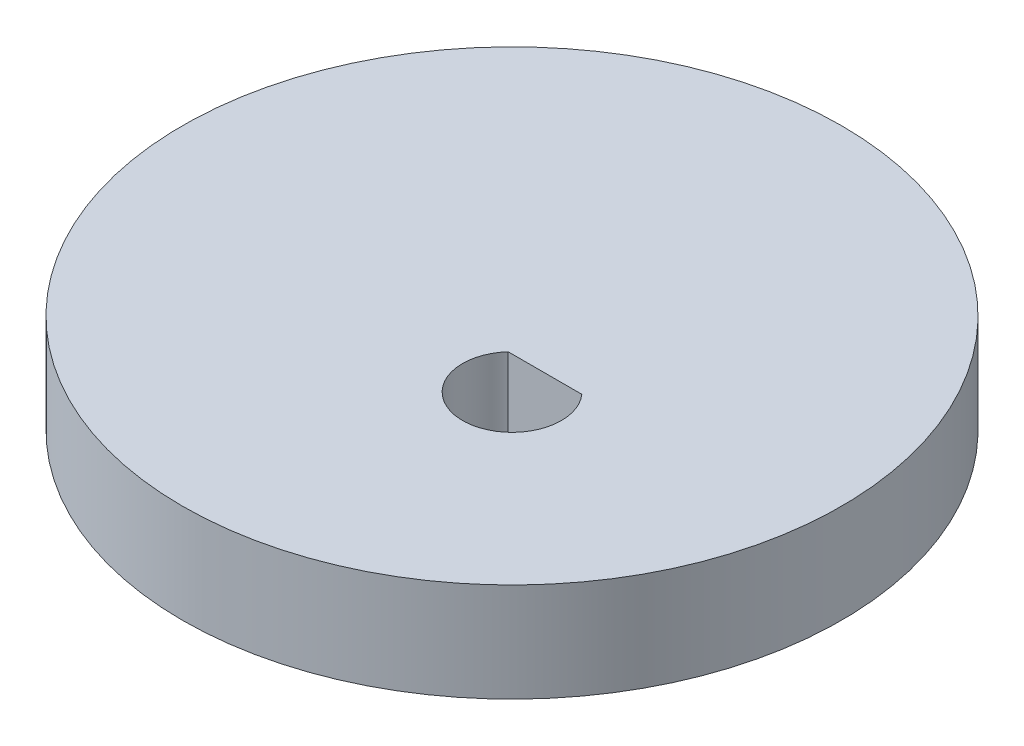
ISO-10303-21;
HEADER;
FILE_DESCRIPTION(('STEP AP214'),'2;1');
FILE_NAME('part.step','',(''),(''),'','','');
FILE_SCHEMA(('AUTOMOTIVE_DESIGN { 1 0 10303 214 1 1 1 1 }'));
ENDSEC;
DATA;
#1=APPLICATION_CONTEXT('core data for automotive mechanical design processes');
#2=APPLICATION_PROTOCOL_DEFINITION('international standard','automotive_design',2000,#1);
#3=PRODUCT_CONTEXT('',#1,'mechanical');
#4=PRODUCT('Part','Part','',(#3));
#5=PRODUCT_RELATED_PRODUCT_CATEGORY('part','',(#4));
#6=PRODUCT_DEFINITION_FORMATION('','',#4);
#7=PRODUCT_DEFINITION_CONTEXT('part definition',#1,'design');
#8=PRODUCT_DEFINITION('design','',#6,#7);
#9=PRODUCT_DEFINITION_SHAPE('','',#8);
#10=(LENGTH_UNIT() NAMED_UNIT(*) SI_UNIT(.MILLI.,.METRE.));
#11=(NAMED_UNIT(*) PLANE_ANGLE_UNIT() SI_UNIT($,.RADIAN.));
#12=(NAMED_UNIT(*) SI_UNIT($,.STERADIAN.) SOLID_ANGLE_UNIT());
#13=UNCERTAINTY_MEASURE_WITH_UNIT(LENGTH_MEASURE(1.E-05),#10,'distance_accuracy_value','');
#14=(GEOMETRIC_REPRESENTATION_CONTEXT(3) GLOBAL_UNCERTAINTY_ASSIGNED_CONTEXT((#13)) GLOBAL_UNIT_ASSIGNED_CONTEXT((#10,
#11,#12)) REPRESENTATION_CONTEXT('',''));
#15=CARTESIAN_POINT('',(0.,0.,0.));
#16=DIRECTION('',(0.,0.,1.));
#17=DIRECTION('',(1.,0.,0.));
#18=AXIS2_PLACEMENT_3D('',#15,#16,#17);
#19=CARTESIAN_POINT('',(0.,3.,0.));
#20=DIRECTION('',(0.,-1.,0.));
#21=DIRECTION('',(0.,0.,-1.));
#22=AXIS2_PLACEMENT_3D('',#19,#20,#21);
#23=CYLINDRICAL_SURFACE('',#22,10.);
#24=CARTESIAN_POINT('',(0.,3.,0.));
#25=DIRECTION('',(0.,1.,0.));
#26=DIRECTION('',(0.,0.,1.));
#27=AXIS2_PLACEMENT_3D('',#24,#25,#26);
#28=CIRCLE('',#27,10.);
#29=CARTESIAN_POINT('',(0.,3.,10.));
#30=VERTEX_POINT('',#29);
#31=EDGE_CURVE('E11',#30,#30,#28,.T.);
#32=ORIENTED_EDGE('',*,*,#31,.F.);
#33=EDGE_LOOP('',(#32));
#34=FACE_BOUND('',#33,.T.);
#35=CARTESIAN_POINT('',(0.,0.,0.));
#36=DIRECTION('',(0.,1.,0.));
#37=DIRECTION('',(0.,0.,1.));
#38=AXIS2_PLACEMENT_3D('',#35,#36,#37);
#39=CIRCLE('',#38,10.);
#40=CARTESIAN_POINT('',(0.,0.,10.));
#41=VERTEX_POINT('',#40);
#42=EDGE_CURVE('E38',#41,#41,#39,.T.);
#43=ORIENTED_EDGE('',*,*,#42,.T.);
#44=EDGE_LOOP('',(#43));
#45=FACE_BOUND('',#44,.T.);
#46=ADVANCED_FACE('F35',(#34,#45),#23,.T.);
#47=CARTESIAN_POINT('',(0.,3.,0.));
#48=DIRECTION('',(0.,1.,0.));
#49=DIRECTION('',(0.,0.,1.));
#50=AXIS2_PLACEMENT_3D('',#47,#48,#49);
#51=PLANE('',#50);
#52=CARTESIAN_POINT('',(2.,3.,2.));
#53=DIRECTION('',(0.,1.,0.));
#54=DIRECTION('',(0.,0.,1.));
#55=AXIS2_PLACEMENT_3D('',#52,#53,#54);
#56=CIRCLE('',#55,1.5);
#57=CARTESIAN_POINT('',(0.881966011250106,3.,1.));
#58=VERTEX_POINT('',#57);
#59=CARTESIAN_POINT('',(3.1180339887499,3.,1.));
#60=VERTEX_POINT('',#59);
#61=EDGE_CURVE('E49',#58,#60,#56,.T.);
#62=ORIENTED_EDGE('',*,*,#61,.F.);
#63=DIRECTION('',(-1.,0.,0.));
#64=VECTOR('',#63,1.);
#65=CARTESIAN_POINT('',(0.881966011250106,3.,1.));
#66=LINE('',#65,#64);
#67=EDGE_CURVE('E68',#60,#58,#66,.T.);
#68=ORIENTED_EDGE('',*,*,#67,.F.);
#69=EDGE_LOOP('',(#62,#68));
#70=FACE_BOUND('',#69,.T.);
#71=ORIENTED_EDGE('',*,*,#31,.T.);
#72=EDGE_LOOP('',(#71));
#73=FACE_BOUND('',#72,.T.);
#74=ADVANCED_FACE('F72',(#70,#73),#51,.T.);
#75=CARTESIAN_POINT('',(0.,0.,0.));
#76=DIRECTION('',(0.,1.,0.));
#77=DIRECTION('',(0.,0.,1.));
#78=AXIS2_PLACEMENT_3D('',#75,#76,#77);
#79=PLANE('',#78);
#80=DIRECTION('',(-1.,0.,0.));
#81=VECTOR('',#80,1.);
#82=CARTESIAN_POINT('',(0.881966011250106,0.,1.));
#83=LINE('',#82,#81);
#84=CARTESIAN_POINT('',(3.1180339887499,0.,1.));
#85=VERTEX_POINT('',#84);
#86=CARTESIAN_POINT('',(0.881966011250106,0.,1.));
#87=VERTEX_POINT('',#86);
#88=EDGE_CURVE('E76',#85,#87,#83,.T.);
#89=ORIENTED_EDGE('',*,*,#88,.T.);
#90=CARTESIAN_POINT('',(2.,0.,2.));
#91=DIRECTION('',(0.,1.,0.));
#92=DIRECTION('',(0.,0.,1.));
#93=AXIS2_PLACEMENT_3D('',#90,#91,#92);
#94=CIRCLE('',#93,1.5);
#95=EDGE_CURVE('E54',#87,#85,#94,.T.);
#96=ORIENTED_EDGE('',*,*,#95,.T.);
#97=EDGE_LOOP('',(#89,#96));
#98=FACE_BOUND('',#97,.T.);
#99=ORIENTED_EDGE('',*,*,#42,.F.);
#100=EDGE_LOOP('',(#99));
#101=FACE_BOUND('',#100,.T.);
#102=ADVANCED_FACE('F80',(#98,#101),#79,.F.);
#103=CARTESIAN_POINT('',(2.,0.,2.));
#104=DIRECTION('',(0.,1.,0.));
#105=DIRECTION('',(0.,0.,1.));
#106=AXIS2_PLACEMENT_3D('',#103,#104,#105);
#107=CYLINDRICAL_SURFACE('',#106,1.5);
#108=ORIENTED_EDGE('',*,*,#61,.T.);
#109=DIRECTION('',(0.,1.,0.));
#110=VECTOR('',#109,1.);
#111=CARTESIAN_POINT('',(3.1180339887499,0.,1.));
#112=LINE('',#111,#110);
#113=EDGE_CURVE('E65',#85,#60,#112,.T.);
#114=ORIENTED_EDGE('',*,*,#113,.F.);
#115=ORIENTED_EDGE('',*,*,#95,.F.);
#116=DIRECTION('',(0.,1.,0.));
#117=VECTOR('',#116,1.);
#118=CARTESIAN_POINT('',(0.881966011250106,0.,1.));
#119=LINE('',#118,#117);
#120=EDGE_CURVE('E59',#87,#58,#119,.T.);
#121=ORIENTED_EDGE('',*,*,#120,.T.);
#122=EDGE_LOOP('',(#108,#114,#115,#121));
#123=FACE_BOUND('',#122,.T.);
#124=ADVANCED_FACE('F61',(#123),#107,.F.);
#125=CARTESIAN_POINT('',(0.881966011250106,0.,1.));
#126=DIRECTION('',(0.,0.,-1.));
#127=DIRECTION('',(-1.,0.,0.));
#128=AXIS2_PLACEMENT_3D('',#125,#126,#127);
#129=PLANE('',#128);
#130=ORIENTED_EDGE('',*,*,#67,.T.);
#131=ORIENTED_EDGE('',*,*,#120,.F.);
#132=ORIENTED_EDGE('',*,*,#88,.F.);
#133=ORIENTED_EDGE('',*,*,#113,.T.);
#134=EDGE_LOOP('',(#130,#131,#132,#133));
#135=FACE_BOUND('',#134,.T.);
#136=ADVANCED_FACE('F69',(#135),#129,.F.);
#137=CLOSED_SHELL('',(#46,#74,#102,#124,#136));
#138=MANIFOLD_SOLID_BREP('B2',#137);
#139=ADVANCED_BREP_SHAPE_REPRESENTATION('',(#18,#138),#14);
#140=SHAPE_DEFINITION_REPRESENTATION(#9,#139);
ENDSEC;
END-ISO-10303-21;
